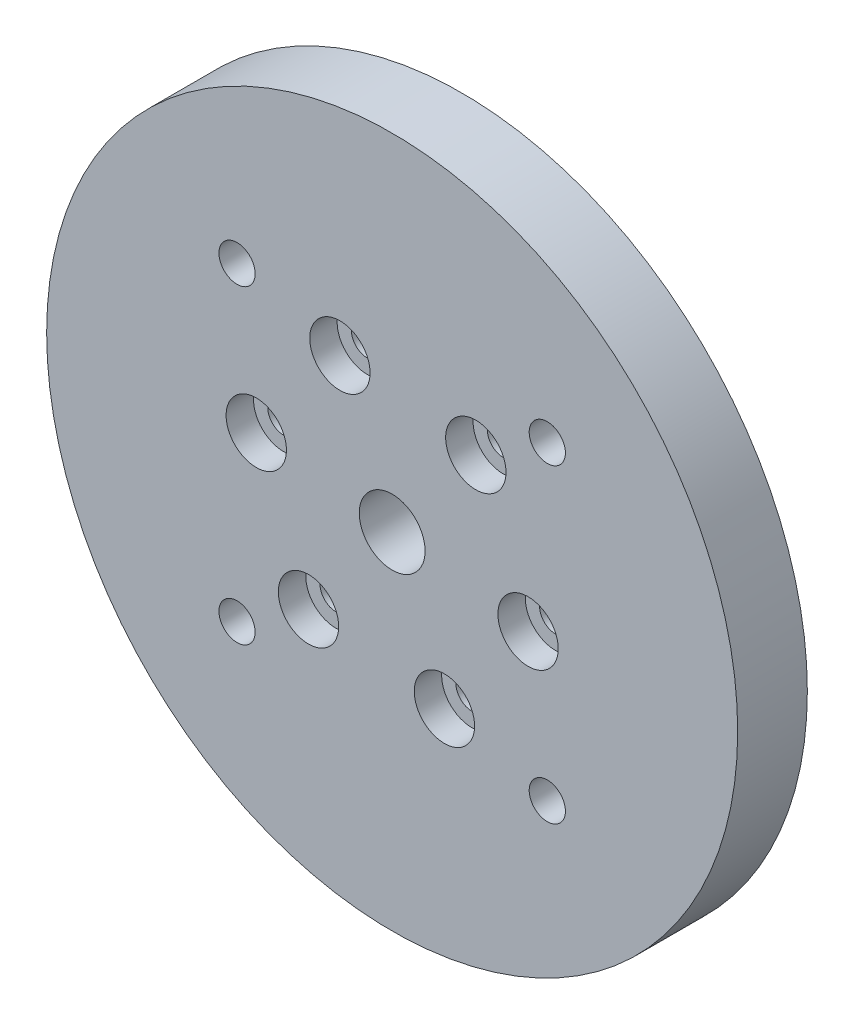
ISO-10303-21;
HEADER;
FILE_DESCRIPTION(('STEP AP214'),'2;1');
FILE_NAME('part.step','',(''),(''),'','','');
FILE_SCHEMA(('AUTOMOTIVE_DESIGN { 1 0 10303 214 1 1 1 1 }'));
ENDSEC;
DATA;
#1=APPLICATION_CONTEXT('core data for automotive mechanical design processes');
#2=APPLICATION_PROTOCOL_DEFINITION('international standard','automotive_design',2000,#1);
#3=PRODUCT_CONTEXT('',#1,'mechanical');
#4=PRODUCT('Part','Part','',(#3));
#5=PRODUCT_RELATED_PRODUCT_CATEGORY('part','',(#4));
#6=PRODUCT_DEFINITION_FORMATION('','',#4);
#7=PRODUCT_DEFINITION_CONTEXT('part definition',#1,'design');
#8=PRODUCT_DEFINITION('design','',#6,#7);
#9=PRODUCT_DEFINITION_SHAPE('','',#8);
#10=(LENGTH_UNIT() NAMED_UNIT(*) SI_UNIT(.MILLI.,.METRE.));
#11=(NAMED_UNIT(*) PLANE_ANGLE_UNIT() SI_UNIT($,.RADIAN.));
#12=(NAMED_UNIT(*) SI_UNIT($,.STERADIAN.) SOLID_ANGLE_UNIT());
#13=UNCERTAINTY_MEASURE_WITH_UNIT(LENGTH_MEASURE(1.E-05),#10,'distance_accuracy_value','');
#14=(GEOMETRIC_REPRESENTATION_CONTEXT(3) GLOBAL_UNCERTAINTY_ASSIGNED_CONTEXT((#13)) GLOBAL_UNIT_ASSIGNED_CONTEXT((#10,
#11,#12)) REPRESENTATION_CONTEXT('',''));
#15=CARTESIAN_POINT('',(0.,0.,0.));
#16=DIRECTION('',(0.,0.,1.));
#17=DIRECTION('',(1.,0.,0.));
#18=AXIS2_PLACEMENT_3D('',#15,#16,#17);
#19=CARTESIAN_POINT('',(7.62681454876585,9.90362054193988,573.35));
#20=DIRECTION('',(0.,0.,-1.));
#21=DIRECTION('',(-1.,0.,0.));
#22=AXIS2_PLACEMENT_3D('',#19,#20,#21);
#23=CYLINDRICAL_SURFACE('',#22,1.45);
#24=CARTESIAN_POINT('',(7.62681454876585,9.90362054193988,567.));
#25=DIRECTION('',(0.,0.,1.));
#26=DIRECTION('',(1.,0.,0.));
#27=AXIS2_PLACEMENT_3D('',#24,#25,#26);
#28=CIRCLE('',#27,1.45);
#29=CARTESIAN_POINT('',(9.07681454876585,9.90362054193988,567.));
#30=VERTEX_POINT('',#29);
#31=EDGE_CURVE('E90',#30,#30,#28,.T.);
#32=ORIENTED_EDGE('',*,*,#31,.F.);
#33=EDGE_LOOP('',(#32));
#34=FACE_BOUND('',#33,.T.);
#35=CARTESIAN_POINT('',(7.62681454876585,9.90362054193988,570.85));
#36=DIRECTION('',(0.,0.,1.));
#37=DIRECTION('',(1.,0.,0.));
#38=AXIS2_PLACEMENT_3D('',#35,#36,#37);
#39=CIRCLE('',#38,1.45);
#40=CARTESIAN_POINT('',(9.07681454876585,9.90362054193988,570.85));
#41=VERTEX_POINT('',#40);
#42=EDGE_CURVE('E41',#41,#41,#39,.T.);
#43=ORIENTED_EDGE('',*,*,#42,.T.);
#44=EDGE_LOOP('',(#43));
#45=FACE_BOUND('',#44,.T.);
#46=ADVANCED_FACE('F40',(#34,#45),#23,.F.);
#47=CARTESIAN_POINT('',(-4.76337970437843,11.5568254201539,573.35));
#48=DIRECTION('',(0.,0.,-1.));
#49=DIRECTION('',(-1.,0.,0.));
#50=AXIS2_PLACEMENT_3D('',#47,#48,#49);
#51=CYLINDRICAL_SURFACE('',#50,1.45);
#52=CARTESIAN_POINT('',(-4.76337970437843,11.5568254201539,567.));
#53=DIRECTION('',(0.,0.,1.));
#54=DIRECTION('',(1.,0.,0.));
#55=AXIS2_PLACEMENT_3D('',#52,#53,#54);
#56=CIRCLE('',#55,1.45);
#57=CARTESIAN_POINT('',(-3.31337970437843,11.5568254201539,567.));
#58=VERTEX_POINT('',#57);
#59=EDGE_CURVE('E92',#58,#58,#56,.T.);
#60=ORIENTED_EDGE('',*,*,#59,.F.);
#61=EDGE_LOOP('',(#60));
#62=FACE_BOUND('',#61,.T.);
#63=CARTESIAN_POINT('',(-4.76337970437843,11.5568254201539,570.85));
#64=DIRECTION('',(0.,0.,1.));
#65=DIRECTION('',(1.,0.,0.));
#66=AXIS2_PLACEMENT_3D('',#63,#64,#65);
#67=CIRCLE('',#66,1.45);
#68=CARTESIAN_POINT('',(-3.31337970437843,11.5568254201539,570.85));
#69=VERTEX_POINT('',#68);
#70=EDGE_CURVE('E70',#69,#69,#67,.T.);
#71=ORIENTED_EDGE('',*,*,#70,.T.);
#72=EDGE_LOOP('',(#71));
#73=FACE_BOUND('',#72,.T.);
#74=ADVANCED_FACE('F144',(#62,#73),#51,.F.);
#75=CARTESIAN_POINT('',(-12.3901942531443,1.65320487821403,573.35));
#76=DIRECTION('',(0.,0.,-1.));
#77=DIRECTION('',(-1.,0.,0.));
#78=AXIS2_PLACEMENT_3D('',#75,#76,#77);
#79=CYLINDRICAL_SURFACE('',#78,1.45);
#80=CARTESIAN_POINT('',(-12.3901942531443,1.65320487821403,567.));
#81=DIRECTION('',(0.,0.,1.));
#82=DIRECTION('',(1.,0.,0.));
#83=AXIS2_PLACEMENT_3D('',#80,#81,#82);
#84=CIRCLE('',#83,1.45);
#85=CARTESIAN_POINT('',(-10.9401942531443,1.65320487821403,567.));
#86=VERTEX_POINT('',#85);
#87=EDGE_CURVE('E81',#86,#86,#84,.T.);
#88=ORIENTED_EDGE('',*,*,#87,.F.);
#89=EDGE_LOOP('',(#88));
#90=FACE_BOUND('',#89,.T.);
#91=CARTESIAN_POINT('',(-12.3901942531443,1.65320487821403,570.85));
#92=DIRECTION('',(0.,0.,1.));
#93=DIRECTION('',(1.,0.,0.));
#94=AXIS2_PLACEMENT_3D('',#91,#92,#93);
#95=CIRCLE('',#94,1.45);
#96=CARTESIAN_POINT('',(-10.9401942531443,1.65320487821403,570.85));
#97=VERTEX_POINT('',#96);
#98=EDGE_CURVE('E67',#97,#97,#95,.T.);
#99=ORIENTED_EDGE('',*,*,#98,.T.);
#100=EDGE_LOOP('',(#99));
#101=FACE_BOUND('',#100,.T.);
#102=ADVANCED_FACE('F147',(#90,#101),#79,.F.);
#103=CARTESIAN_POINT('',(-7.62681454876585,-9.90362054193988,573.35));
#104=DIRECTION('',(0.,0.,-1.));
#105=DIRECTION('',(-1.,0.,0.));
#106=AXIS2_PLACEMENT_3D('',#103,#104,#105);
#107=CYLINDRICAL_SURFACE('',#106,1.45);
#108=CARTESIAN_POINT('',(-7.62681454876585,-9.90362054193988,567.));
#109=DIRECTION('',(0.,0.,1.));
#110=DIRECTION('',(1.,0.,0.));
#111=AXIS2_PLACEMENT_3D('',#108,#109,#110);
#112=CIRCLE('',#111,1.45);
#113=CARTESIAN_POINT('',(-6.17681454876585,-9.90362054193988,567.));
#114=VERTEX_POINT('',#113);
#115=EDGE_CURVE('E80',#114,#114,#112,.T.);
#116=ORIENTED_EDGE('',*,*,#115,.F.);
#117=EDGE_LOOP('',(#116));
#118=FACE_BOUND('',#117,.T.);
#119=CARTESIAN_POINT('',(-7.62681454876585,-9.90362054193988,570.85));
#120=DIRECTION('',(0.,0.,1.));
#121=DIRECTION('',(1.,0.,0.));
#122=AXIS2_PLACEMENT_3D('',#119,#120,#121);
#123=CIRCLE('',#122,1.45);
#124=CARTESIAN_POINT('',(-6.17681454876585,-9.90362054193988,570.85));
#125=VERTEX_POINT('',#124);
#126=EDGE_CURVE('E65',#125,#125,#123,.T.);
#127=ORIENTED_EDGE('',*,*,#126,.T.);
#128=EDGE_LOOP('',(#127));
#129=FACE_BOUND('',#128,.T.);
#130=ADVANCED_FACE('F156',(#118,#129),#107,.F.);
#131=CARTESIAN_POINT('',(4.76337970437842,-11.5568254201539,573.35));
#132=DIRECTION('',(0.,0.,-1.));
#133=DIRECTION('',(-1.,0.,0.));
#134=AXIS2_PLACEMENT_3D('',#131,#132,#133);
#135=CYLINDRICAL_SURFACE('',#134,1.45);
#136=CARTESIAN_POINT('',(4.76337970437842,-11.5568254201539,567.));
#137=DIRECTION('',(0.,0.,1.));
#138=DIRECTION('',(1.,0.,0.));
#139=AXIS2_PLACEMENT_3D('',#136,#137,#138);
#140=CIRCLE('',#139,1.45);
#141=CARTESIAN_POINT('',(6.21337970437842,-11.5568254201539,567.));
#142=VERTEX_POINT('',#141);
#143=EDGE_CURVE('E73',#142,#142,#140,.T.);
#144=ORIENTED_EDGE('',*,*,#143,.F.);
#145=EDGE_LOOP('',(#144));
#146=FACE_BOUND('',#145,.T.);
#147=CARTESIAN_POINT('',(4.76337970437842,-11.5568254201539,570.85));
#148=DIRECTION('',(0.,0.,1.));
#149=DIRECTION('',(1.,0.,0.));
#150=AXIS2_PLACEMENT_3D('',#147,#148,#149);
#151=CIRCLE('',#150,1.45);
#152=CARTESIAN_POINT('',(6.21337970437842,-11.5568254201539,570.85));
#153=VERTEX_POINT('',#152);
#154=EDGE_CURVE('E56',#153,#153,#151,.T.);
#155=ORIENTED_EDGE('',*,*,#154,.T.);
#156=EDGE_LOOP('',(#155));
#157=FACE_BOUND('',#156,.T.);
#158=ADVANCED_FACE('F153',(#146,#157),#135,.F.);
#159=CARTESIAN_POINT('',(12.3901942531443,-1.65320487821403,573.35));
#160=DIRECTION('',(0.,0.,-1.));
#161=DIRECTION('',(-1.,0.,0.));
#162=AXIS2_PLACEMENT_3D('',#159,#160,#161);
#163=CYLINDRICAL_SURFACE('',#162,1.45);
#164=CARTESIAN_POINT('',(12.3901942531443,-1.65320487821403,567.));
#165=DIRECTION('',(0.,0.,1.));
#166=DIRECTION('',(1.,0.,0.));
#167=AXIS2_PLACEMENT_3D('',#164,#165,#166);
#168=CIRCLE('',#167,1.45);
#169=CARTESIAN_POINT('',(13.8401942531443,-1.65320487821403,567.));
#170=VERTEX_POINT('',#169);
#171=EDGE_CURVE('E87',#170,#170,#168,.T.);
#172=ORIENTED_EDGE('',*,*,#171,.F.);
#173=EDGE_LOOP('',(#172));
#174=FACE_BOUND('',#173,.T.);
#175=CARTESIAN_POINT('',(12.3901942531443,-1.65320487821403,570.85));
#176=DIRECTION('',(0.,0.,1.));
#177=DIRECTION('',(1.,0.,0.));
#178=AXIS2_PLACEMENT_3D('',#175,#176,#177);
#179=CIRCLE('',#178,1.45);
#180=CARTESIAN_POINT('',(13.8401942531443,-1.65320487821403,570.85));
#181=VERTEX_POINT('',#180);
#182=EDGE_CURVE('E57',#181,#181,#179,.T.);
#183=ORIENTED_EDGE('',*,*,#182,.T.);
#184=EDGE_LOOP('',(#183));
#185=FACE_BOUND('',#184,.T.);
#186=ADVANCED_FACE('F206',(#174,#185),#163,.F.);
#187=CARTESIAN_POINT('',(0.,0.,573.35));
#188=DIRECTION('',(0.,0.,-1.));
#189=DIRECTION('',(-1.,0.,0.));
#190=AXIS2_PLACEMENT_3D('',#187,#188,#189);
#191=CYLINDRICAL_SURFACE('',#190,31.5);
#192=CARTESIAN_POINT('',(0.,0.,573.35));
#193=DIRECTION('',(0.,0.,1.));
#194=DIRECTION('',(1.,0.,0.));
#195=AXIS2_PLACEMENT_3D('',#192,#193,#194);
#196=CIRCLE('',#195,31.5);
#197=CARTESIAN_POINT('',(31.5,0.,573.35));
#198=VERTEX_POINT('',#197);
#199=EDGE_CURVE('E10',#198,#198,#196,.T.);
#200=ORIENTED_EDGE('',*,*,#199,.F.);
#201=EDGE_LOOP('',(#200));
#202=FACE_BOUND('',#201,.T.);
#203=CARTESIAN_POINT('',(0.,0.,567.));
#204=DIRECTION('',(0.,0.,1.));
#205=DIRECTION('',(1.,0.,0.));
#206=AXIS2_PLACEMENT_3D('',#203,#204,#205);
#207=CIRCLE('',#206,31.5);
#208=CARTESIAN_POINT('',(31.5,0.,567.));
#209=VERTEX_POINT('',#208);
#210=EDGE_CURVE('E44',#209,#209,#207,.T.);
#211=ORIENTED_EDGE('',*,*,#210,.T.);
#212=EDGE_LOOP('',(#211));
#213=FACE_BOUND('',#212,.T.);
#214=ADVANCED_FACE('F39',(#202,#213),#191,.T.);
#215=CARTESIAN_POINT('',(0.,0.,573.35));
#216=DIRECTION('',(0.,0.,1.));
#217=DIRECTION('',(1.,0.,0.));
#218=AXIS2_PLACEMENT_3D('',#215,#216,#217);
#219=PLANE('',#218);
#220=CARTESIAN_POINT('',(7.62681454876585,9.90362054193988,573.35));
#221=DIRECTION('',(0.,0.,1.));
#222=DIRECTION('',(1.,0.,0.));
#223=AXIS2_PLACEMENT_3D('',#220,#221,#222);
#224=CIRCLE('',#223,2.75);
#225=CARTESIAN_POINT('',(10.3768145487658,9.90362054193988,573.35));
#226=VERTEX_POINT('',#225);
#227=EDGE_CURVE('E215',#226,#226,#224,.T.);
#228=ORIENTED_EDGE('',*,*,#227,.F.);
#229=EDGE_LOOP('',(#228));
#230=FACE_BOUND('',#229,.T.);
#231=CARTESIAN_POINT('',(-4.76337970437843,11.5568254201539,573.35));
#232=DIRECTION('',(0.,0.,1.));
#233=DIRECTION('',(1.,0.,0.));
#234=AXIS2_PLACEMENT_3D('',#231,#232,#233);
#235=CIRCLE('',#234,2.75);
#236=CARTESIAN_POINT('',(-2.01337970437843,11.5568254201539,573.35));
#237=VERTEX_POINT('',#236);
#238=EDGE_CURVE('E219',#237,#237,#235,.T.);
#239=ORIENTED_EDGE('',*,*,#238,.F.);
#240=EDGE_LOOP('',(#239));
#241=FACE_BOUND('',#240,.T.);
#242=CARTESIAN_POINT('',(-12.3901942531443,1.65320487821403,573.35));
#243=DIRECTION('',(0.,0.,1.));
#244=DIRECTION('',(1.,0.,0.));
#245=AXIS2_PLACEMENT_3D('',#242,#243,#244);
#246=CIRCLE('',#245,2.75);
#247=CARTESIAN_POINT('',(-9.64019425314427,1.65320487821403,573.35));
#248=VERTEX_POINT('',#247);
#249=EDGE_CURVE('E222',#248,#248,#246,.T.);
#250=ORIENTED_EDGE('',*,*,#249,.F.);
#251=EDGE_LOOP('',(#250));
#252=FACE_BOUND('',#251,.T.);
#253=CARTESIAN_POINT('',(-7.62681454876585,-9.90362054193988,573.35));
#254=DIRECTION('',(0.,0.,1.));
#255=DIRECTION('',(1.,0.,0.));
#256=AXIS2_PLACEMENT_3D('',#253,#254,#255);
#257=CIRCLE('',#256,2.75);
#258=CARTESIAN_POINT('',(-4.87681454876585,-9.90362054193988,573.35));
#259=VERTEX_POINT('',#258);
#260=EDGE_CURVE('E221',#259,#259,#257,.T.);
#261=ORIENTED_EDGE('',*,*,#260,.F.);
#262=EDGE_LOOP('',(#261));
#263=FACE_BOUND('',#262,.T.);
#264=CARTESIAN_POINT('',(4.76337970437842,-11.5568254201539,573.35));
#265=DIRECTION('',(0.,0.,1.));
#266=DIRECTION('',(1.,0.,0.));
#267=AXIS2_PLACEMENT_3D('',#264,#265,#266);
#268=CIRCLE('',#267,2.75);
#269=CARTESIAN_POINT('',(7.51337970437842,-11.5568254201539,573.35));
#270=VERTEX_POINT('',#269);
#271=EDGE_CURVE('E230',#270,#270,#268,.T.);
#272=ORIENTED_EDGE('',*,*,#271,.F.);
#273=EDGE_LOOP('',(#272));
#274=FACE_BOUND('',#273,.T.);
#275=CARTESIAN_POINT('',(12.3901942531443,-1.65320487821403,573.35));
#276=DIRECTION('',(0.,0.,1.));
#277=DIRECTION('',(1.,0.,0.));
#278=AXIS2_PLACEMENT_3D('',#275,#276,#277);
#279=CIRCLE('',#278,2.75);
#280=CARTESIAN_POINT('',(15.1401942531443,-1.65320487821403,573.35));
#281=VERTEX_POINT('',#280);
#282=EDGE_CURVE('E58',#281,#281,#279,.T.);
#283=ORIENTED_EDGE('',*,*,#282,.F.);
#284=EDGE_LOOP('',(#283));
#285=FACE_BOUND('',#284,.T.);
#286=CARTESIAN_POINT('',(14.1421356237309,-14.142135623731,573.35));
#287=DIRECTION('',(0.,0.,1.));
#288=DIRECTION('',(1.,0.,0.));
#289=AXIS2_PLACEMENT_3D('',#286,#287,#288);
#290=CIRCLE('',#289,1.65);
#291=CARTESIAN_POINT('',(15.7921356237309,-14.142135623731,573.35));
#292=VERTEX_POINT('',#291);
#293=EDGE_CURVE('E115',#292,#292,#290,.T.);
#294=ORIENTED_EDGE('',*,*,#293,.F.);
#295=EDGE_LOOP('',(#294));
#296=FACE_BOUND('',#295,.T.);
#297=CARTESIAN_POINT('',(-14.142135623731,-14.1421356237309,573.35));
#298=DIRECTION('',(0.,0.,1.));
#299=DIRECTION('',(1.,0.,0.));
#300=AXIS2_PLACEMENT_3D('',#297,#298,#299);
#301=CIRCLE('',#300,1.65);
#302=CARTESIAN_POINT('',(-12.492135623731,-14.1421356237309,573.35));
#303=VERTEX_POINT('',#302);
#304=EDGE_CURVE('E106',#303,#303,#301,.T.);
#305=ORIENTED_EDGE('',*,*,#304,.F.);
#306=EDGE_LOOP('',(#305));
#307=FACE_BOUND('',#306,.T.);
#308=CARTESIAN_POINT('',(-14.1421356237309,14.142135623731,573.35));
#309=DIRECTION('',(0.,0.,1.));
#310=DIRECTION('',(1.,0.,0.));
#311=AXIS2_PLACEMENT_3D('',#308,#309,#310);
#312=CIRCLE('',#311,1.65);
#313=CARTESIAN_POINT('',(-12.4921356237309,14.142135623731,573.35));
#314=VERTEX_POINT('',#313);
#315=EDGE_CURVE('E99',#314,#314,#312,.T.);
#316=ORIENTED_EDGE('',*,*,#315,.F.);
#317=EDGE_LOOP('',(#316));
#318=FACE_BOUND('',#317,.T.);
#319=CARTESIAN_POINT('',(14.142135623731,14.142135623731,573.35));
#320=DIRECTION('',(0.,0.,1.));
#321=DIRECTION('',(1.,0.,0.));
#322=AXIS2_PLACEMENT_3D('',#319,#320,#321);
#323=CIRCLE('',#322,1.65);
#324=CARTESIAN_POINT('',(15.792135623731,14.142135623731,573.35));
#325=VERTEX_POINT('',#324);
#326=EDGE_CURVE('E114',#325,#325,#323,.T.);
#327=ORIENTED_EDGE('',*,*,#326,.F.);
#328=EDGE_LOOP('',(#327));
#329=FACE_BOUND('',#328,.T.);
#330=CARTESIAN_POINT('',(0.,0.,573.35));
#331=DIRECTION('',(0.,0.,1.));
#332=DIRECTION('',(1.,0.,0.));
#333=AXIS2_PLACEMENT_3D('',#330,#331,#332);
#334=CIRCLE('',#333,3.);
#335=CARTESIAN_POINT('',(3.,0.,573.35));
#336=VERTEX_POINT('',#335);
#337=EDGE_CURVE('E49',#336,#336,#334,.T.);
#338=ORIENTED_EDGE('',*,*,#337,.F.);
#339=EDGE_LOOP('',(#338));
#340=FACE_BOUND('',#339,.T.);
#341=ORIENTED_EDGE('',*,*,#199,.T.);
#342=EDGE_LOOP('',(#341));
#343=FACE_BOUND('',#342,.T.);
#344=ADVANCED_FACE('F136',(#230,#241,#252,#263,#274,#285,#296,#307,#318,#329,#340,#343),#219,.T.);
#345=CARTESIAN_POINT('',(0.,0.,567.));
#346=DIRECTION('',(0.,0.,1.));
#347=DIRECTION('',(1.,0.,0.));
#348=AXIS2_PLACEMENT_3D('',#345,#346,#347);
#349=PLANE('',#348);
#350=ORIENTED_EDGE('',*,*,#171,.T.);
#351=EDGE_LOOP('',(#350));
#352=FACE_BOUND('',#351,.T.);
#353=ORIENTED_EDGE('',*,*,#143,.T.);
#354=EDGE_LOOP('',(#353));
#355=FACE_BOUND('',#354,.T.);
#356=ORIENTED_EDGE('',*,*,#115,.T.);
#357=EDGE_LOOP('',(#356));
#358=FACE_BOUND('',#357,.T.);
#359=ORIENTED_EDGE('',*,*,#87,.T.);
#360=EDGE_LOOP('',(#359));
#361=FACE_BOUND('',#360,.T.);
#362=ORIENTED_EDGE('',*,*,#59,.T.);
#363=EDGE_LOOP('',(#362));
#364=FACE_BOUND('',#363,.T.);
#365=ORIENTED_EDGE('',*,*,#31,.T.);
#366=EDGE_LOOP('',(#365));
#367=FACE_BOUND('',#366,.T.);
#368=CARTESIAN_POINT('',(14.1421356237309,-14.142135623731,567.));
#369=DIRECTION('',(0.,0.,1.));
#370=DIRECTION('',(1.,0.,0.));
#371=AXIS2_PLACEMENT_3D('',#368,#369,#370);
#372=CIRCLE('',#371,1.65);
#373=CARTESIAN_POINT('',(15.7921356237309,-14.142135623731,567.));
#374=VERTEX_POINT('',#373);
#375=EDGE_CURVE('E107',#374,#374,#372,.T.);
#376=ORIENTED_EDGE('',*,*,#375,.T.);
#377=EDGE_LOOP('',(#376));
#378=FACE_BOUND('',#377,.T.);
#379=CARTESIAN_POINT('',(-14.142135623731,-14.1421356237309,567.));
#380=DIRECTION('',(0.,0.,1.));
#381=DIRECTION('',(1.,0.,0.));
#382=AXIS2_PLACEMENT_3D('',#379,#380,#381);
#383=CIRCLE('',#382,1.65);
#384=CARTESIAN_POINT('',(-12.492135623731,-14.1421356237309,567.));
#385=VERTEX_POINT('',#384);
#386=EDGE_CURVE('E101',#385,#385,#383,.T.);
#387=ORIENTED_EDGE('',*,*,#386,.T.);
#388=EDGE_LOOP('',(#387));
#389=FACE_BOUND('',#388,.T.);
#390=CARTESIAN_POINT('',(-14.1421356237309,14.142135623731,567.));
#391=DIRECTION('',(0.,0.,1.));
#392=DIRECTION('',(1.,0.,0.));
#393=AXIS2_PLACEMENT_3D('',#390,#391,#392);
#394=CIRCLE('',#393,1.65);
#395=CARTESIAN_POINT('',(-12.4921356237309,14.142135623731,567.));
#396=VERTEX_POINT('',#395);
#397=EDGE_CURVE('E98',#396,#396,#394,.T.);
#398=ORIENTED_EDGE('',*,*,#397,.T.);
#399=EDGE_LOOP('',(#398));
#400=FACE_BOUND('',#399,.T.);
#401=CARTESIAN_POINT('',(14.142135623731,14.142135623731,567.));
#402=DIRECTION('',(0.,0.,1.));
#403=DIRECTION('',(1.,0.,0.));
#404=AXIS2_PLACEMENT_3D('',#401,#402,#403);
#405=CIRCLE('',#404,1.65);
#406=CARTESIAN_POINT('',(15.792135623731,14.142135623731,567.));
#407=VERTEX_POINT('',#406);
#408=EDGE_CURVE('E100',#407,#407,#405,.T.);
#409=ORIENTED_EDGE('',*,*,#408,.T.);
#410=EDGE_LOOP('',(#409));
#411=FACE_BOUND('',#410,.T.);
#412=CARTESIAN_POINT('',(0.,0.,567.));
#413=DIRECTION('',(0.,0.,1.));
#414=DIRECTION('',(1.,0.,0.));
#415=AXIS2_PLACEMENT_3D('',#412,#413,#414);
#416=CIRCLE('',#415,3.);
#417=CARTESIAN_POINT('',(3.,0.,567.));
#418=VERTEX_POINT('',#417);
#419=EDGE_CURVE('E52',#418,#418,#416,.T.);
#420=ORIENTED_EDGE('',*,*,#419,.T.);
#421=EDGE_LOOP('',(#420));
#422=FACE_BOUND('',#421,.T.);
#423=ORIENTED_EDGE('',*,*,#210,.F.);
#424=EDGE_LOOP('',(#423));
#425=FACE_BOUND('',#424,.T.);
#426=ADVANCED_FACE('F123',(#352,#355,#358,#361,#364,#367,#378,#389,#400,#411,#422,#425),#349,.F.);
#427=CARTESIAN_POINT('',(0.,0.,573.35));
#428=DIRECTION('',(0.,0.,-1.));
#429=DIRECTION('',(-1.,0.,0.));
#430=AXIS2_PLACEMENT_3D('',#427,#428,#429);
#431=CYLINDRICAL_SURFACE('',#430,3.);
#432=ORIENTED_EDGE('',*,*,#337,.T.);
#433=EDGE_LOOP('',(#432));
#434=FACE_BOUND('',#433,.T.);
#435=ORIENTED_EDGE('',*,*,#419,.F.);
#436=EDGE_LOOP('',(#435));
#437=FACE_BOUND('',#436,.T.);
#438=ADVANCED_FACE('F130',(#434,#437),#431,.F.);
#439=CARTESIAN_POINT('',(14.142135623731,14.142135623731,573.35));
#440=DIRECTION('',(0.,0.,-1.));
#441=DIRECTION('',(-1.,0.,0.));
#442=AXIS2_PLACEMENT_3D('',#439,#440,#441);
#443=CYLINDRICAL_SURFACE('',#442,1.65);
#444=ORIENTED_EDGE('',*,*,#326,.T.);
#445=EDGE_LOOP('',(#444));
#446=FACE_BOUND('',#445,.T.);
#447=ORIENTED_EDGE('',*,*,#408,.F.);
#448=EDGE_LOOP('',(#447));
#449=FACE_BOUND('',#448,.T.);
#450=ADVANCED_FACE('F127',(#446,#449),#443,.F.);
#451=CARTESIAN_POINT('',(-14.1421356237309,14.142135623731,573.35));
#452=DIRECTION('',(0.,0.,-1.));
#453=DIRECTION('',(-1.,0.,0.));
#454=AXIS2_PLACEMENT_3D('',#451,#452,#453);
#455=CYLINDRICAL_SURFACE('',#454,1.65);
#456=ORIENTED_EDGE('',*,*,#315,.T.);
#457=EDGE_LOOP('',(#456));
#458=FACE_BOUND('',#457,.T.);
#459=ORIENTED_EDGE('',*,*,#397,.F.);
#460=EDGE_LOOP('',(#459));
#461=FACE_BOUND('',#460,.T.);
#462=ADVANCED_FACE('F137',(#458,#461),#455,.F.);
#463=CARTESIAN_POINT('',(-14.142135623731,-14.1421356237309,573.35));
#464=DIRECTION('',(0.,0.,-1.));
#465=DIRECTION('',(-1.,0.,0.));
#466=AXIS2_PLACEMENT_3D('',#463,#464,#465);
#467=CYLINDRICAL_SURFACE('',#466,1.65);
#468=ORIENTED_EDGE('',*,*,#304,.T.);
#469=EDGE_LOOP('',(#468));
#470=FACE_BOUND('',#469,.T.);
#471=ORIENTED_EDGE('',*,*,#386,.F.);
#472=EDGE_LOOP('',(#471));
#473=FACE_BOUND('',#472,.T.);
#474=ADVANCED_FACE('F170',(#470,#473),#467,.F.);
#475=CARTESIAN_POINT('',(14.1421356237309,-14.142135623731,573.35));
#476=DIRECTION('',(0.,0.,-1.));
#477=DIRECTION('',(-1.,0.,0.));
#478=AXIS2_PLACEMENT_3D('',#475,#476,#477);
#479=CYLINDRICAL_SURFACE('',#478,1.65);
#480=ORIENTED_EDGE('',*,*,#293,.T.);
#481=EDGE_LOOP('',(#480));
#482=FACE_BOUND('',#481,.T.);
#483=ORIENTED_EDGE('',*,*,#375,.F.);
#484=EDGE_LOOP('',(#483));
#485=FACE_BOUND('',#484,.T.);
#486=ADVANCED_FACE('F171',(#482,#485),#479,.F.);
#487=CARTESIAN_POINT('',(12.3901942531443,-1.65320487821403,573.35));
#488=DIRECTION('',(0.,0.,-1.));
#489=DIRECTION('',(-1.,0.,0.));
#490=AXIS2_PLACEMENT_3D('',#487,#488,#489);
#491=CYLINDRICAL_SURFACE('',#490,2.75);
#492=ORIENTED_EDGE('',*,*,#282,.T.);
#493=EDGE_LOOP('',(#492));
#494=FACE_BOUND('',#493,.T.);
#495=CARTESIAN_POINT('',(12.3901942531443,-1.65320487821403,570.85));
#496=DIRECTION('',(0.,0.,1.));
#497=DIRECTION('',(1.,0.,0.));
#498=AXIS2_PLACEMENT_3D('',#495,#496,#497);
#499=CIRCLE('',#498,2.75);
#500=CARTESIAN_POINT('',(15.1401942531443,-1.65320487821403,570.85));
#501=VERTEX_POINT('',#500);
#502=EDGE_CURVE('E235',#501,#501,#499,.T.);
#503=ORIENTED_EDGE('',*,*,#502,.F.);
#504=EDGE_LOOP('',(#503));
#505=FACE_BOUND('',#504,.T.);
#506=ADVANCED_FACE('F172',(#494,#505),#491,.F.);
#507=CARTESIAN_POINT('',(12.3901942531443,-1.65320487821403,570.85));
#508=DIRECTION('',(0.,0.,1.));
#509=DIRECTION('',(1.,0.,0.));
#510=AXIS2_PLACEMENT_3D('',#507,#508,#509);
#511=PLANE('',#510);
#512=ORIENTED_EDGE('',*,*,#182,.F.);
#513=EDGE_LOOP('',(#512));
#514=FACE_BOUND('',#513,.T.);
#515=ORIENTED_EDGE('',*,*,#502,.T.);
#516=EDGE_LOOP('',(#515));
#517=FACE_BOUND('',#516,.T.);
#518=ADVANCED_FACE('F177',(#514,#517),#511,.T.);
#519=CARTESIAN_POINT('',(4.76337970437842,-11.5568254201539,573.35));
#520=DIRECTION('',(0.,0.,-1.));
#521=DIRECTION('',(-1.,0.,0.));
#522=AXIS2_PLACEMENT_3D('',#519,#520,#521);
#523=CYLINDRICAL_SURFACE('',#522,2.75);
#524=ORIENTED_EDGE('',*,*,#271,.T.);
#525=EDGE_LOOP('',(#524));
#526=FACE_BOUND('',#525,.T.);
#527=CARTESIAN_POINT('',(4.76337970437842,-11.5568254201539,570.85));
#528=DIRECTION('',(0.,0.,1.));
#529=DIRECTION('',(1.,0.,0.));
#530=AXIS2_PLACEMENT_3D('',#527,#528,#529);
#531=CIRCLE('',#530,2.75);
#532=CARTESIAN_POINT('',(7.51337970437842,-11.5568254201539,570.85));
#533=VERTEX_POINT('',#532);
#534=EDGE_CURVE('E237',#533,#533,#531,.T.);
#535=ORIENTED_EDGE('',*,*,#534,.F.);
#536=EDGE_LOOP('',(#535));
#537=FACE_BOUND('',#536,.T.);
#538=ADVANCED_FACE('F258',(#526,#537),#523,.F.);
#539=CARTESIAN_POINT('',(4.76337970437842,-11.5568254201539,570.85));
#540=DIRECTION('',(0.,0.,1.));
#541=DIRECTION('',(1.,0.,0.));
#542=AXIS2_PLACEMENT_3D('',#539,#540,#541);
#543=PLANE('',#542);
#544=ORIENTED_EDGE('',*,*,#154,.F.);
#545=EDGE_LOOP('',(#544));
#546=FACE_BOUND('',#545,.T.);
#547=ORIENTED_EDGE('',*,*,#534,.T.);
#548=EDGE_LOOP('',(#547));
#549=FACE_BOUND('',#548,.T.);
#550=ADVANCED_FACE('F256',(#546,#549),#543,.T.);
#551=CARTESIAN_POINT('',(-7.62681454876585,-9.90362054193988,573.35));
#552=DIRECTION('',(0.,0.,-1.));
#553=DIRECTION('',(-1.,0.,0.));
#554=AXIS2_PLACEMENT_3D('',#551,#552,#553);
#555=CYLINDRICAL_SURFACE('',#554,2.75);
#556=ORIENTED_EDGE('',*,*,#260,.T.);
#557=EDGE_LOOP('',(#556));
#558=FACE_BOUND('',#557,.T.);
#559=CARTESIAN_POINT('',(-7.62681454876585,-9.90362054193988,570.85));
#560=DIRECTION('',(0.,0.,1.));
#561=DIRECTION('',(1.,0.,0.));
#562=AXIS2_PLACEMENT_3D('',#559,#560,#561);
#563=CIRCLE('',#562,2.75);
#564=CARTESIAN_POINT('',(-4.87681454876585,-9.90362054193988,570.85));
#565=VERTEX_POINT('',#564);
#566=EDGE_CURVE('E238',#565,#565,#563,.T.);
#567=ORIENTED_EDGE('',*,*,#566,.F.);
#568=EDGE_LOOP('',(#567));
#569=FACE_BOUND('',#568,.T.);
#570=ADVANCED_FACE('F270',(#558,#569),#555,.F.);
#571=CARTESIAN_POINT('',(-7.62681454876585,-9.90362054193988,570.85));
#572=DIRECTION('',(0.,0.,1.));
#573=DIRECTION('',(1.,0.,0.));
#574=AXIS2_PLACEMENT_3D('',#571,#572,#573);
#575=PLANE('',#574);
#576=ORIENTED_EDGE('',*,*,#126,.F.);
#577=EDGE_LOOP('',(#576));
#578=FACE_BOUND('',#577,.T.);
#579=ORIENTED_EDGE('',*,*,#566,.T.);
#580=EDGE_LOOP('',(#579));
#581=FACE_BOUND('',#580,.T.);
#582=ADVANCED_FACE('F291',(#578,#581),#575,.T.);
#583=CARTESIAN_POINT('',(-12.3901942531443,1.65320487821403,573.35));
#584=DIRECTION('',(0.,0.,-1.));
#585=DIRECTION('',(-1.,0.,0.));
#586=AXIS2_PLACEMENT_3D('',#583,#584,#585);
#587=CYLINDRICAL_SURFACE('',#586,2.75);
#588=ORIENTED_EDGE('',*,*,#249,.T.);
#589=EDGE_LOOP('',(#588));
#590=FACE_BOUND('',#589,.T.);
#591=CARTESIAN_POINT('',(-12.3901942531443,1.65320487821403,570.85));
#592=DIRECTION('',(0.,0.,1.));
#593=DIRECTION('',(1.,0.,0.));
#594=AXIS2_PLACEMENT_3D('',#591,#592,#593);
#595=CIRCLE('',#594,2.75);
#596=CARTESIAN_POINT('',(-9.64019425314427,1.65320487821403,570.85));
#597=VERTEX_POINT('',#596);
#598=EDGE_CURVE('E243',#597,#597,#595,.T.);
#599=ORIENTED_EDGE('',*,*,#598,.F.);
#600=EDGE_LOOP('',(#599));
#601=FACE_BOUND('',#600,.T.);
#602=ADVANCED_FACE('F286',(#590,#601),#587,.F.);
#603=CARTESIAN_POINT('',(-12.3901942531443,1.65320487821403,570.85));
#604=DIRECTION('',(0.,0.,1.));
#605=DIRECTION('',(1.,0.,0.));
#606=AXIS2_PLACEMENT_3D('',#603,#604,#605);
#607=PLANE('',#606);
#608=ORIENTED_EDGE('',*,*,#98,.F.);
#609=EDGE_LOOP('',(#608));
#610=FACE_BOUND('',#609,.T.);
#611=ORIENTED_EDGE('',*,*,#598,.T.);
#612=EDGE_LOOP('',(#611));
#613=FACE_BOUND('',#612,.T.);
#614=ADVANCED_FACE('F283',(#610,#613),#607,.T.);
#615=CARTESIAN_POINT('',(-4.76337970437843,11.5568254201539,573.35));
#616=DIRECTION('',(0.,0.,-1.));
#617=DIRECTION('',(-1.,0.,0.));
#618=AXIS2_PLACEMENT_3D('',#615,#616,#617);
#619=CYLINDRICAL_SURFACE('',#618,2.75);
#620=ORIENTED_EDGE('',*,*,#238,.T.);
#621=EDGE_LOOP('',(#620));
#622=FACE_BOUND('',#621,.T.);
#623=CARTESIAN_POINT('',(-4.76337970437843,11.5568254201539,570.85));
#624=DIRECTION('',(0.,0.,1.));
#625=DIRECTION('',(1.,0.,0.));
#626=AXIS2_PLACEMENT_3D('',#623,#624,#625);
#627=CIRCLE('',#626,2.75);
#628=CARTESIAN_POINT('',(-2.01337970437843,11.5568254201539,570.85));
#629=VERTEX_POINT('',#628);
#630=EDGE_CURVE('E250',#629,#629,#627,.T.);
#631=ORIENTED_EDGE('',*,*,#630,.F.);
#632=EDGE_LOOP('',(#631));
#633=FACE_BOUND('',#632,.T.);
#634=ADVANCED_FACE('F284',(#622,#633),#619,.F.);
#635=CARTESIAN_POINT('',(-4.76337970437843,11.5568254201539,570.85));
#636=DIRECTION('',(0.,0.,1.));
#637=DIRECTION('',(1.,0.,0.));
#638=AXIS2_PLACEMENT_3D('',#635,#636,#637);
#639=PLANE('',#638);
#640=ORIENTED_EDGE('',*,*,#70,.F.);
#641=EDGE_LOOP('',(#640));
#642=FACE_BOUND('',#641,.T.);
#643=ORIENTED_EDGE('',*,*,#630,.T.);
#644=EDGE_LOOP('',(#643));
#645=FACE_BOUND('',#644,.T.);
#646=ADVANCED_FACE('F276',(#642,#645),#639,.T.);
#647=CARTESIAN_POINT('',(7.62681454876585,9.90362054193988,573.35));
#648=DIRECTION('',(0.,0.,-1.));
#649=DIRECTION('',(-1.,0.,0.));
#650=AXIS2_PLACEMENT_3D('',#647,#648,#649);
#651=CYLINDRICAL_SURFACE('',#650,2.75);
#652=ORIENTED_EDGE('',*,*,#227,.T.);
#653=EDGE_LOOP('',(#652));
#654=FACE_BOUND('',#653,.T.);
#655=CARTESIAN_POINT('',(7.62681454876585,9.90362054193988,570.85));
#656=DIRECTION('',(0.,0.,1.));
#657=DIRECTION('',(1.,0.,0.));
#658=AXIS2_PLACEMENT_3D('',#655,#656,#657);
#659=CIRCLE('',#658,2.75);
#660=CARTESIAN_POINT('',(10.3768145487658,9.90362054193988,570.85));
#661=VERTEX_POINT('',#660);
#662=EDGE_CURVE('E232',#661,#661,#659,.T.);
#663=ORIENTED_EDGE('',*,*,#662,.F.);
#664=EDGE_LOOP('',(#663));
#665=FACE_BOUND('',#664,.T.);
#666=ADVANCED_FACE('F271',(#654,#665),#651,.F.);
#667=CARTESIAN_POINT('',(7.62681454876585,9.90362054193988,570.85));
#668=DIRECTION('',(0.,0.,1.));
#669=DIRECTION('',(1.,0.,0.));
#670=AXIS2_PLACEMENT_3D('',#667,#668,#669);
#671=PLANE('',#670);
#672=ORIENTED_EDGE('',*,*,#42,.F.);
#673=EDGE_LOOP('',(#672));
#674=FACE_BOUND('',#673,.T.);
#675=ORIENTED_EDGE('',*,*,#662,.T.);
#676=EDGE_LOOP('',(#675));
#677=FACE_BOUND('',#676,.T.);
#678=ADVANCED_FACE('F279',(#674,#677),#671,.T.);
#679=CLOSED_SHELL('',(#46,#74,#102,#130,#158,#186,#214,#344,#426,#438,#450,#462,#474,#486,#506,
#518,#538,#550,#570,#582,#602,#614,#634,#646,#666,#678));
#680=MANIFOLD_SOLID_BREP('B2',#679);
#681=ADVANCED_BREP_SHAPE_REPRESENTATION('',(#18,#680),#14);
#682=SHAPE_DEFINITION_REPRESENTATION(#9,#681);
ENDSEC;
END-ISO-10303-21;
